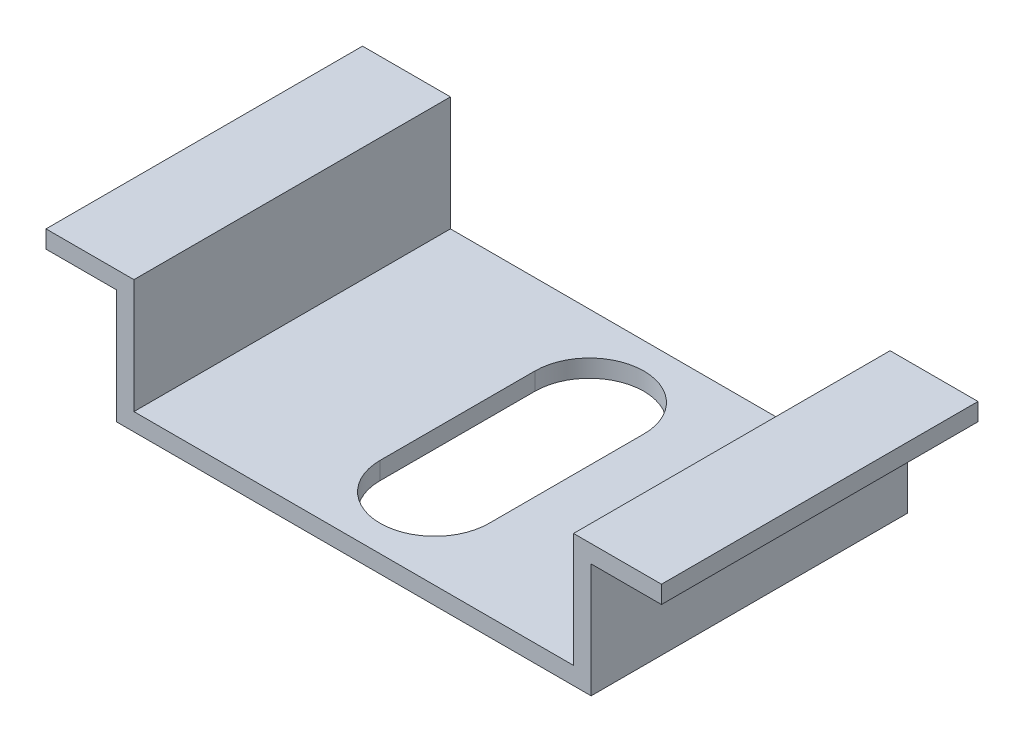
ISO-10303-21;
HEADER;
FILE_DESCRIPTION(('STEP AP214'),'2;1');
FILE_NAME('part.step','',(''),(''),'','','');
FILE_SCHEMA(('AUTOMOTIVE_DESIGN { 1 0 10303 214 1 1 1 1 }'));
ENDSEC;
DATA;
#1=APPLICATION_CONTEXT('core data for automotive mechanical design processes');
#2=APPLICATION_PROTOCOL_DEFINITION('international standard','automotive_design',2000,#1);
#3=PRODUCT_CONTEXT('',#1,'mechanical');
#4=PRODUCT('Part','Part','',(#3));
#5=PRODUCT_RELATED_PRODUCT_CATEGORY('part','',(#4));
#6=PRODUCT_DEFINITION_FORMATION('','',#4);
#7=PRODUCT_DEFINITION_CONTEXT('part definition',#1,'design');
#8=PRODUCT_DEFINITION('design','',#6,#7);
#9=PRODUCT_DEFINITION_SHAPE('','',#8);
#10=(LENGTH_UNIT() NAMED_UNIT(*) SI_UNIT(.MILLI.,.METRE.));
#11=(NAMED_UNIT(*) PLANE_ANGLE_UNIT() SI_UNIT($,.RADIAN.));
#12=(NAMED_UNIT(*) SI_UNIT($,.STERADIAN.) SOLID_ANGLE_UNIT());
#13=UNCERTAINTY_MEASURE_WITH_UNIT(LENGTH_MEASURE(1.E-05),#10,'distance_accuracy_value','');
#14=(GEOMETRIC_REPRESENTATION_CONTEXT(3) GLOBAL_UNCERTAINTY_ASSIGNED_CONTEXT((#13)) GLOBAL_UNIT_ASSIGNED_CONTEXT((#10,
#11,#12)) REPRESENTATION_CONTEXT('',''));
#15=CARTESIAN_POINT('',(0.,0.,0.));
#16=DIRECTION('',(0.,0.,1.));
#17=DIRECTION('',(1.,0.,0.));
#18=AXIS2_PLACEMENT_3D('',#15,#16,#17);
#19=CARTESIAN_POINT('',(0.,0.,0.));
#20=DIRECTION('',(0.,1.,0.));
#21=DIRECTION('',(0.,0.,1.));
#22=AXIS2_PLACEMENT_3D('',#19,#20,#21);
#23=PLANE('',#22);
#24=DIRECTION('',(0.,0.,1.));
#25=VECTOR('',#24,1.);
#26=CARTESIAN_POINT('',(-35.,0.,0.));
#27=LINE('',#26,#25);
#28=CARTESIAN_POINT('',(-35.,0.,15.));
#29=VERTEX_POINT('',#28);
#30=CARTESIAN_POINT('',(-35.,0.,32.9999999999999));
#31=VERTEX_POINT('',#30);
#32=EDGE_CURVE('E182',#29,#31,#27,.T.);
#33=ORIENTED_EDGE('',*,*,#32,.T.);
#34=DIRECTION('',(1.,0.,0.));
#35=VECTOR('',#34,1.);
#36=CARTESIAN_POINT('',(0.,0.,32.9999999999999));
#37=LINE('',#36,#35);
#38=CARTESIAN_POINT('',(-30.,0.,32.9999999999999));
#39=VERTEX_POINT('',#38);
#40=EDGE_CURVE('E198',#31,#39,#37,.T.);
#41=ORIENTED_EDGE('',*,*,#40,.T.);
#42=DIRECTION('',(0.,0.,-1.));
#43=VECTOR('',#42,1.);
#44=CARTESIAN_POINT('',(-30.,0.,175.));
#45=LINE('',#44,#43);
#46=CARTESIAN_POINT('',(-30.,0.,15.));
#47=VERTEX_POINT('',#46);
#48=EDGE_CURVE('E170',#39,#47,#45,.T.);
#49=ORIENTED_EDGE('',*,*,#48,.T.);
#50=DIRECTION('',(-1.,0.,0.));
#51=VECTOR('',#50,1.);
#52=CARTESIAN_POINT('',(0.,0.,15.));
#53=LINE('',#52,#51);
#54=EDGE_CURVE('E227',#47,#29,#53,.T.);
#55=ORIENTED_EDGE('',*,*,#54,.T.);
#56=EDGE_LOOP('',(#33,#41,#49,#55));
#57=FACE_BOUND('',#56,.T.);
#58=ADVANCED_FACE('F35',(#57),#23,.T.);
#59=CARTESIAN_POINT('',(0.,-7.5,175.));
#60=DIRECTION('',(1.,0.,0.));
#61=DIRECTION('',(0.,0.,-1.));
#62=AXIS2_PLACEMENT_3D('',#59,#60,#61);
#63=PLANE('',#62);
#64=DIRECTION('',(0.,0.,-1.));
#65=VECTOR('',#64,1.);
#66=CARTESIAN_POINT('',(0.,0.,175.));
#67=LINE('',#66,#65);
#68=CARTESIAN_POINT('',(0.,0.,32.9999999999999));
#69=VERTEX_POINT('',#68);
#70=CARTESIAN_POINT('',(0.,0.,15.));
#71=VERTEX_POINT('',#70);
#72=EDGE_CURVE('E152',#69,#71,#67,.T.);
#73=ORIENTED_EDGE('',*,*,#72,.F.);
#74=DIRECTION('',(0.,-1.,0.));
#75=VECTOR('',#74,1.);
#76=CARTESIAN_POINT('',(0.,-7.5,32.9999999999999));
#77=LINE('',#76,#75);
#78=CARTESIAN_POINT('',(0.,-1.,32.9999999999999));
#79=VERTEX_POINT('',#78);
#80=EDGE_CURVE('E147',#69,#79,#77,.T.);
#81=ORIENTED_EDGE('',*,*,#80,.T.);
#82=DIRECTION('',(0.,0.,-1.));
#83=VECTOR('',#82,1.);
#84=CARTESIAN_POINT('',(0.,-1.,175.));
#85=LINE('',#84,#83);
#86=CARTESIAN_POINT('',(0.,-1.,15.));
#87=VERTEX_POINT('',#86);
#88=EDGE_CURVE('E57',#79,#87,#85,.T.);
#89=ORIENTED_EDGE('',*,*,#88,.T.);
#90=DIRECTION('',(0.,1.,0.));
#91=VECTOR('',#90,1.);
#92=CARTESIAN_POINT('',(0.,-7.5,15.));
#93=LINE('',#92,#91);
#94=EDGE_CURVE('E193',#87,#71,#93,.T.);
#95=ORIENTED_EDGE('',*,*,#94,.T.);
#96=EDGE_LOOP('',(#73,#81,#89,#95));
#97=FACE_BOUND('',#96,.T.);
#98=ADVANCED_FACE('F37',(#97),#63,.T.);
#99=CARTESIAN_POINT('',(-35.,-7.5,0.));
#100=DIRECTION('',(-1.,0.,0.));
#101=DIRECTION('',(0.,0.,1.));
#102=AXIS2_PLACEMENT_3D('',#99,#100,#101);
#103=PLANE('',#102);
#104=DIRECTION('',(0.,0.,-1.));
#105=VECTOR('',#104,1.);
#106=CARTESIAN_POINT('',(-35.,-1.,175.));
#107=LINE('',#106,#105);
#108=CARTESIAN_POINT('',(-35.,-1.,32.9999999999999));
#109=VERTEX_POINT('',#108);
#110=CARTESIAN_POINT('',(-35.,-1.,15.));
#111=VERTEX_POINT('',#110);
#112=EDGE_CURVE('E162',#109,#111,#107,.T.);
#113=ORIENTED_EDGE('',*,*,#112,.F.);
#114=DIRECTION('',(0.,1.,0.));
#115=VECTOR('',#114,1.);
#116=CARTESIAN_POINT('',(-35.,-7.5,32.9999999999999));
#117=LINE('',#116,#115);
#118=EDGE_CURVE('E202',#109,#31,#117,.T.);
#119=ORIENTED_EDGE('',*,*,#118,.T.);
#120=ORIENTED_EDGE('',*,*,#32,.F.);
#121=DIRECTION('',(0.,-1.,0.));
#122=VECTOR('',#121,1.);
#123=CARTESIAN_POINT('',(-35.,-7.5,15.));
#124=LINE('',#123,#122);
#125=EDGE_CURVE('E224',#29,#111,#124,.T.);
#126=ORIENTED_EDGE('',*,*,#125,.T.);
#127=EDGE_LOOP('',(#113,#119,#120,#126));
#128=FACE_BOUND('',#127,.T.);
#129=ADVANCED_FACE('F298',(#128),#103,.T.);
#130=CARTESIAN_POINT('',(0.,-7.5,0.));
#131=DIRECTION('',(0.,1.,0.));
#132=DIRECTION('',(0.,0.,1.));
#133=AXIS2_PLACEMENT_3D('',#130,#131,#132);
#134=PLANE('',#133);
#135=DIRECTION('',(0.,0.,1.));
#136=VECTOR('',#135,1.);
#137=CARTESIAN_POINT('',(-20.6000000000001,-7.50000000000003,19.6));
#138=LINE('',#137,#136);
#139=CARTESIAN_POINT('',(-20.6000000000001,-7.50000000000003,19.6));
#140=VERTEX_POINT('',#139);
#141=CARTESIAN_POINT('',(-20.6000000000001,-7.50000000000003,28.4));
#142=VERTEX_POINT('',#141);
#143=EDGE_CURVE('E241',#140,#142,#138,.T.);
#144=ORIENTED_EDGE('',*,*,#143,.T.);
#145=CARTESIAN_POINT('',(-17.5000000000001,-7.50000000000003,28.4));
#146=DIRECTION('',(0.,1.,0.));
#147=DIRECTION('',(-1.,0.,0.));
#148=AXIS2_PLACEMENT_3D('',#145,#146,#147);
#149=CIRCLE('',#148,3.1);
#150=CARTESIAN_POINT('',(-14.4000000000001,-7.50000000000002,28.4));
#151=VERTEX_POINT('',#150);
#152=EDGE_CURVE('E231',#142,#151,#149,.T.);
#153=ORIENTED_EDGE('',*,*,#152,.T.);
#154=DIRECTION('',(0.,0.,-1.));
#155=VECTOR('',#154,1.);
#156=CARTESIAN_POINT('',(-14.4000000000001,-7.50000000000002,28.4));
#157=LINE('',#156,#155);
#158=CARTESIAN_POINT('',(-14.4000000000001,-7.5,19.6));
#159=VERTEX_POINT('',#158);
#160=EDGE_CURVE('E234',#151,#159,#157,.T.);
#161=ORIENTED_EDGE('',*,*,#160,.T.);
#162=CARTESIAN_POINT('',(-17.5000000000001,-7.50000000000003,19.6));
#163=DIRECTION('',(0.,1.,0.));
#164=DIRECTION('',(-1.,0.,0.));
#165=AXIS2_PLACEMENT_3D('',#162,#163,#164);
#166=CIRCLE('',#165,3.1);
#167=EDGE_CURVE('E238',#159,#140,#166,.T.);
#168=ORIENTED_EDGE('',*,*,#167,.T.);
#169=EDGE_LOOP('',(#144,#153,#161,#168));
#170=FACE_BOUND('',#169,.T.);
#171=DIRECTION('',(1.,0.,0.));
#172=VECTOR('',#171,1.);
#173=CARTESIAN_POINT('',(0.,-7.5,32.9999999999999));
#174=LINE('',#173,#172);
#175=CARTESIAN_POINT('',(-31.,-7.5,32.9999999999999));
#176=VERTEX_POINT('',#175);
#177=CARTESIAN_POINT('',(-4.,-7.5,32.9999999999999));
#178=VERTEX_POINT('',#177);
#179=EDGE_CURVE('E154',#176,#178,#174,.T.);
#180=ORIENTED_EDGE('',*,*,#179,.F.);
#181=DIRECTION('',(0.,0.,-1.));
#182=VECTOR('',#181,1.);
#183=CARTESIAN_POINT('',(-31.,-7.5,175.));
#184=LINE('',#183,#182);
#185=CARTESIAN_POINT('',(-31.,-7.5,15.));
#186=VERTEX_POINT('',#185);
#187=EDGE_CURVE('E168',#176,#186,#184,.T.);
#188=ORIENTED_EDGE('',*,*,#187,.T.);
#189=DIRECTION('',(-1.,0.,0.));
#190=VECTOR('',#189,1.);
#191=CARTESIAN_POINT('',(0.,-7.5,15.));
#192=LINE('',#191,#190);
#193=CARTESIAN_POINT('',(-4.,-7.5,15.));
#194=VERTEX_POINT('',#193);
#195=EDGE_CURVE('E197',#194,#186,#192,.T.);
#196=ORIENTED_EDGE('',*,*,#195,.F.);
#197=DIRECTION('',(0.,0.,-1.));
#198=VECTOR('',#197,1.);
#199=CARTESIAN_POINT('',(-4.,-7.5,175.));
#200=LINE('',#199,#198);
#201=EDGE_CURVE('E159',#178,#194,#200,.T.);
#202=ORIENTED_EDGE('',*,*,#201,.F.);
#203=EDGE_LOOP('',(#180,#188,#196,#202));
#204=FACE_BOUND('',#203,.T.);
#205=ADVANCED_FACE('F276',(#170,#204),#134,.F.);
#206=DIRECTION('',(0.,0.,-1.));
#207=VECTOR('',#206,1.);
#208=CARTESIAN_POINT('',(-5.,0.,175.));
#209=LINE('',#208,#207);
#210=CARTESIAN_POINT('',(-5.,0.,32.9999999999999));
#211=VERTEX_POINT('',#210);
#212=CARTESIAN_POINT('',(-5.,0.,15.));
#213=VERTEX_POINT('',#212);
#214=EDGE_CURVE('E178',#211,#213,#209,.T.);
#215=ORIENTED_EDGE('',*,*,#214,.F.);
#216=DIRECTION('',(1.,0.,0.));
#217=VECTOR('',#216,1.);
#218=CARTESIAN_POINT('',(0.,0.,32.9999999999999));
#219=LINE('',#218,#217);
#220=EDGE_CURVE('E310',#211,#69,#219,.T.);
#221=ORIENTED_EDGE('',*,*,#220,.T.);
#222=ORIENTED_EDGE('',*,*,#72,.T.);
#223=DIRECTION('',(-1.,0.,0.));
#224=VECTOR('',#223,1.);
#225=CARTESIAN_POINT('',(0.,0.,15.));
#226=LINE('',#225,#224);
#227=EDGE_CURVE('E210',#71,#213,#226,.T.);
#228=ORIENTED_EDGE('',*,*,#227,.T.);
#229=EDGE_LOOP('',(#215,#221,#222,#228));
#230=FACE_BOUND('',#229,.T.);
#231=ADVANCED_FACE('F293',(#230),#23,.T.);
#232=CARTESIAN_POINT('',(-30.,-6.50000000000002,175.));
#233=DIRECTION('',(-1.,0.,0.));
#234=DIRECTION('',(0.,0.,1.));
#235=AXIS2_PLACEMENT_3D('',#232,#233,#234);
#236=PLANE('',#235);
#237=DIRECTION('',(0.,1.,0.));
#238=VECTOR('',#237,1.);
#239=CARTESIAN_POINT('',(-30.,-6.50000000000002,32.9999999999999));
#240=LINE('',#239,#238);
#241=CARTESIAN_POINT('',(-30.,-6.50000000000002,32.9999999999999));
#242=VERTEX_POINT('',#241);
#243=EDGE_CURVE('E324',#242,#39,#240,.T.);
#244=ORIENTED_EDGE('',*,*,#243,.F.);
#245=DIRECTION('',(0.,0.,-1.));
#246=VECTOR('',#245,1.);
#247=CARTESIAN_POINT('',(-30.,-6.50000000000002,175.));
#248=LINE('',#247,#246);
#249=CARTESIAN_POINT('',(-30.,-6.50000000000002,15.));
#250=VERTEX_POINT('',#249);
#251=EDGE_CURVE('E174',#242,#250,#248,.T.);
#252=ORIENTED_EDGE('',*,*,#251,.T.);
#253=DIRECTION('',(0.,-1.,0.));
#254=VECTOR('',#253,1.);
#255=CARTESIAN_POINT('',(-30.,-6.50000000000002,15.));
#256=LINE('',#255,#254);
#257=EDGE_CURVE('E222',#47,#250,#256,.T.);
#258=ORIENTED_EDGE('',*,*,#257,.F.);
#259=ORIENTED_EDGE('',*,*,#48,.F.);
#260=EDGE_LOOP('',(#244,#252,#258,#259));
#261=FACE_BOUND('',#260,.T.);
#262=ADVANCED_FACE('F301',(#261),#236,.F.);
#263=CARTESIAN_POINT('',(-5.,-6.50000000000001,175.));
#264=DIRECTION('',(0.,-1.,0.));
#265=DIRECTION('',(1.,0.,0.));
#266=AXIS2_PLACEMENT_3D('',#263,#264,#265);
#267=PLANE('',#266);
#268=DIRECTION('',(0.,0.,-1.));
#269=VECTOR('',#268,1.);
#270=CARTESIAN_POINT('',(-14.4000000000001,-6.50000000000001,28.4));
#271=LINE('',#270,#269);
#272=CARTESIAN_POINT('',(-14.4000000000001,-6.50000000000001,28.4));
#273=VERTEX_POINT('',#272);
#274=CARTESIAN_POINT('',(-14.4000000000001,-6.50000000000001,19.6));
#275=VERTEX_POINT('',#274);
#276=EDGE_CURVE('E246',#273,#275,#271,.T.);
#277=ORIENTED_EDGE('',*,*,#276,.F.);
#278=CARTESIAN_POINT('',(-17.5000000000001,-6.50000000000001,28.4));
#279=DIRECTION('',(0.,1.,0.));
#280=DIRECTION('',(-1.,0.,0.));
#281=AXIS2_PLACEMENT_3D('',#278,#279,#280);
#282=CIRCLE('',#281,3.1);
#283=CARTESIAN_POINT('',(-20.6000000000001,-6.50000000000002,28.4));
#284=VERTEX_POINT('',#283);
#285=EDGE_CURVE('E230',#284,#273,#282,.T.);
#286=ORIENTED_EDGE('',*,*,#285,.F.);
#287=DIRECTION('',(0.,0.,1.));
#288=VECTOR('',#287,1.);
#289=CARTESIAN_POINT('',(-20.6000000000001,-6.50000000000002,19.6));
#290=LINE('',#289,#288);
#291=CARTESIAN_POINT('',(-20.6000000000001,-6.50000000000002,19.6));
#292=VERTEX_POINT('',#291);
#293=EDGE_CURVE('E235',#292,#284,#290,.T.);
#294=ORIENTED_EDGE('',*,*,#293,.F.);
#295=CARTESIAN_POINT('',(-17.5000000000001,-6.50000000000001,19.6));
#296=DIRECTION('',(0.,1.,0.));
#297=DIRECTION('',(-1.,0.,0.));
#298=AXIS2_PLACEMENT_3D('',#295,#296,#297);
#299=CIRCLE('',#298,3.1);
#300=EDGE_CURVE('E249',#275,#292,#299,.T.);
#301=ORIENTED_EDGE('',*,*,#300,.F.);
#302=EDGE_LOOP('',(#277,#286,#294,#301));
#303=FACE_BOUND('',#302,.T.);
#304=DIRECTION('',(-1.,0.,0.));
#305=VECTOR('',#304,1.);
#306=CARTESIAN_POINT('',(-5.,-6.50000000000001,32.9999999999999));
#307=LINE('',#306,#305);
#308=CARTESIAN_POINT('',(-5.,-6.50000000000001,32.9999999999999));
#309=VERTEX_POINT('',#308);
#310=EDGE_CURVE('E322',#309,#242,#307,.T.);
#311=ORIENTED_EDGE('',*,*,#310,.F.);
#312=DIRECTION('',(0.,0.,-1.));
#313=VECTOR('',#312,1.);
#314=CARTESIAN_POINT('',(-5.,-6.50000000000001,175.));
#315=LINE('',#314,#313);
#316=CARTESIAN_POINT('',(-5.,-6.50000000000001,15.));
#317=VERTEX_POINT('',#316);
#318=EDGE_CURVE('E176',#309,#317,#315,.T.);
#319=ORIENTED_EDGE('',*,*,#318,.T.);
#320=DIRECTION('',(1.,0.,0.));
#321=VECTOR('',#320,1.);
#322=CARTESIAN_POINT('',(-5.,-6.50000000000001,15.));
#323=LINE('',#322,#321);
#324=EDGE_CURVE('E219',#250,#317,#323,.T.);
#325=ORIENTED_EDGE('',*,*,#324,.F.);
#326=ORIENTED_EDGE('',*,*,#251,.F.);
#327=EDGE_LOOP('',(#311,#319,#325,#326));
#328=FACE_BOUND('',#327,.T.);
#329=ADVANCED_FACE('F269',(#303,#328),#267,.F.);
#330=CARTESIAN_POINT('',(-5.,0.,175.));
#331=DIRECTION('',(1.,0.,0.));
#332=DIRECTION('',(0.,0.,-1.));
#333=AXIS2_PLACEMENT_3D('',#330,#331,#332);
#334=PLANE('',#333);
#335=DIRECTION('',(0.,-1.,0.));
#336=VECTOR('',#335,1.);
#337=CARTESIAN_POINT('',(-5.,0.,32.9999999999999));
#338=LINE('',#337,#336);
#339=EDGE_CURVE('E316',#211,#309,#338,.T.);
#340=ORIENTED_EDGE('',*,*,#339,.F.);
#341=ORIENTED_EDGE('',*,*,#214,.T.);
#342=DIRECTION('',(0.,1.,0.));
#343=VECTOR('',#342,1.);
#344=CARTESIAN_POINT('',(-5.,0.,15.));
#345=LINE('',#344,#343);
#346=EDGE_CURVE('E216',#317,#213,#345,.T.);
#347=ORIENTED_EDGE('',*,*,#346,.F.);
#348=ORIENTED_EDGE('',*,*,#318,.F.);
#349=EDGE_LOOP('',(#340,#341,#347,#348));
#350=FACE_BOUND('',#349,.T.);
#351=ADVANCED_FACE('F314',(#350),#334,.F.);
#352=CARTESIAN_POINT('',(-31.,-1.,175.));
#353=DIRECTION('',(1.,0.,0.));
#354=DIRECTION('',(0.,0.,-1.));
#355=AXIS2_PLACEMENT_3D('',#352,#353,#354);
#356=PLANE('',#355);
#357=DIRECTION('',(0.,-1.,0.));
#358=VECTOR('',#357,1.);
#359=CARTESIAN_POINT('',(-31.,-1.,32.9999999999999));
#360=LINE('',#359,#358);
#361=CARTESIAN_POINT('',(-31.,-1.,32.9999999999999));
#362=VERTEX_POINT('',#361);
#363=EDGE_CURVE('E153',#362,#176,#360,.T.);
#364=ORIENTED_EDGE('',*,*,#363,.F.);
#365=DIRECTION('',(0.,0.,-1.));
#366=VECTOR('',#365,1.);
#367=CARTESIAN_POINT('',(-31.,-1.,175.));
#368=LINE('',#367,#366);
#369=CARTESIAN_POINT('',(-31.,-1.,15.));
#370=VERTEX_POINT('',#369);
#371=EDGE_CURVE('E171',#362,#370,#368,.T.);
#372=ORIENTED_EDGE('',*,*,#371,.T.);
#373=DIRECTION('',(0.,1.,0.));
#374=VECTOR('',#373,1.);
#375=CARTESIAN_POINT('',(-31.,-1.,15.));
#376=LINE('',#375,#374);
#377=EDGE_CURVE('E207',#186,#370,#376,.T.);
#378=ORIENTED_EDGE('',*,*,#377,.F.);
#379=ORIENTED_EDGE('',*,*,#187,.F.);
#380=EDGE_LOOP('',(#364,#372,#378,#379));
#381=FACE_BOUND('',#380,.T.);
#382=ADVANCED_FACE('F349',(#381),#356,.F.);
#383=CARTESIAN_POINT('',(-35.,-1.,175.));
#384=DIRECTION('',(0.,1.,0.));
#385=DIRECTION('',(0.,0.,1.));
#386=AXIS2_PLACEMENT_3D('',#383,#384,#385);
#387=PLANE('',#386);
#388=DIRECTION('',(1.,0.,0.));
#389=VECTOR('',#388,1.);
#390=CARTESIAN_POINT('',(-35.,-1.,32.9999999999999));
#391=LINE('',#390,#389);
#392=EDGE_CURVE('E327',#109,#362,#391,.T.);
#393=ORIENTED_EDGE('',*,*,#392,.F.);
#394=ORIENTED_EDGE('',*,*,#112,.T.);
#395=DIRECTION('',(-1.,0.,0.));
#396=VECTOR('',#395,1.);
#397=CARTESIAN_POINT('',(-35.,-1.,15.));
#398=LINE('',#397,#396);
#399=EDGE_CURVE('E213',#370,#111,#398,.T.);
#400=ORIENTED_EDGE('',*,*,#399,.F.);
#401=ORIENTED_EDGE('',*,*,#371,.F.);
#402=EDGE_LOOP('',(#393,#394,#400,#401));
#403=FACE_BOUND('',#402,.T.);
#404=ADVANCED_FACE('F340',(#403),#387,.F.);
#405=CARTESIAN_POINT('',(-4.,-7.5,175.));
#406=DIRECTION('',(-1.,0.,0.));
#407=DIRECTION('',(0.,-1.,0.));
#408=AXIS2_PLACEMENT_3D('',#405,#406,#407);
#409=PLANE('',#408);
#410=DIRECTION('',(0.,1.,0.));
#411=VECTOR('',#410,1.);
#412=CARTESIAN_POINT('',(-4.,-7.5,32.9999999999999));
#413=LINE('',#412,#411);
#414=CARTESIAN_POINT('',(-4.,-1.,32.9999999999999));
#415=VERTEX_POINT('',#414);
#416=EDGE_CURVE('E49',#178,#415,#413,.T.);
#417=ORIENTED_EDGE('',*,*,#416,.F.);
#418=ORIENTED_EDGE('',*,*,#201,.T.);
#419=DIRECTION('',(0.,-1.,0.));
#420=VECTOR('',#419,1.);
#421=CARTESIAN_POINT('',(-4.,-7.5,15.));
#422=LINE('',#421,#420);
#423=CARTESIAN_POINT('',(-4.,-1.,15.));
#424=VERTEX_POINT('',#423);
#425=EDGE_CURVE('E190',#424,#194,#422,.T.);
#426=ORIENTED_EDGE('',*,*,#425,.F.);
#427=DIRECTION('',(0.,0.,-1.));
#428=VECTOR('',#427,1.);
#429=CARTESIAN_POINT('',(-4.,-1.,175.));
#430=LINE('',#429,#428);
#431=EDGE_CURVE('E160',#415,#424,#430,.T.);
#432=ORIENTED_EDGE('',*,*,#431,.F.);
#433=EDGE_LOOP('',(#417,#418,#426,#432));
#434=FACE_BOUND('',#433,.T.);
#435=ADVANCED_FACE('F195',(#434),#409,.F.);
#436=CARTESIAN_POINT('',(-4.,-1.,175.));
#437=DIRECTION('',(0.,1.,0.));
#438=DIRECTION('',(0.,0.,1.));
#439=AXIS2_PLACEMENT_3D('',#436,#437,#438);
#440=PLANE('',#439);
#441=DIRECTION('',(1.,0.,0.));
#442=VECTOR('',#441,1.);
#443=CARTESIAN_POINT('',(-4.,-1.,32.9999999999999));
#444=LINE('',#443,#442);
#445=EDGE_CURVE('E11',#415,#79,#444,.T.);
#446=ORIENTED_EDGE('',*,*,#445,.F.);
#447=ORIENTED_EDGE('',*,*,#431,.T.);
#448=DIRECTION('',(-1.,0.,0.));
#449=VECTOR('',#448,1.);
#450=CARTESIAN_POINT('',(-4.,-1.,15.));
#451=LINE('',#450,#449);
#452=EDGE_CURVE('E43',#87,#424,#451,.T.);
#453=ORIENTED_EDGE('',*,*,#452,.F.);
#454=ORIENTED_EDGE('',*,*,#88,.F.);
#455=EDGE_LOOP('',(#446,#447,#453,#454));
#456=FACE_BOUND('',#455,.T.);
#457=ADVANCED_FACE('F157',(#456),#440,.F.);
#458=CARTESIAN_POINT('',(-17.5000000000001,-7.50000000000003,28.4));
#459=DIRECTION('',(0.,1.,0.));
#460=DIRECTION('',(-1.,0.,0.));
#461=AXIS2_PLACEMENT_3D('',#458,#459,#460);
#462=CYLINDRICAL_SURFACE('',#461,3.1);
#463=ORIENTED_EDGE('',*,*,#285,.T.);
#464=DIRECTION('',(0.,1.,0.));
#465=VECTOR('',#464,1.);
#466=CARTESIAN_POINT('',(-14.4000000000001,-7.50000000000002,28.4));
#467=LINE('',#466,#465);
#468=EDGE_CURVE('E244',#151,#273,#467,.T.);
#469=ORIENTED_EDGE('',*,*,#468,.F.);
#470=ORIENTED_EDGE('',*,*,#152,.F.);
#471=DIRECTION('',(0.,1.,0.));
#472=VECTOR('',#471,1.);
#473=CARTESIAN_POINT('',(-20.6000000000001,-7.50000000000003,28.4));
#474=LINE('',#473,#472);
#475=EDGE_CURVE('E164',#142,#284,#474,.T.);
#476=ORIENTED_EDGE('',*,*,#475,.T.);
#477=EDGE_LOOP('',(#463,#469,#470,#476));
#478=FACE_BOUND('',#477,.T.);
#479=ADVANCED_FACE('F278',(#478),#462,.F.);
#480=CARTESIAN_POINT('',(-20.6000000000001,-7.50000000000003,19.6));
#481=DIRECTION('',(-1.,0.,0.));
#482=DIRECTION('',(0.,0.,1.));
#483=AXIS2_PLACEMENT_3D('',#480,#481,#482);
#484=PLANE('',#483);
#485=ORIENTED_EDGE('',*,*,#293,.T.);
#486=ORIENTED_EDGE('',*,*,#475,.F.);
#487=ORIENTED_EDGE('',*,*,#143,.F.);
#488=DIRECTION('',(0.,1.,0.));
#489=VECTOR('',#488,1.);
#490=CARTESIAN_POINT('',(-20.6000000000001,-7.50000000000003,19.6));
#491=LINE('',#490,#489);
#492=EDGE_CURVE('E255',#140,#292,#491,.T.);
#493=ORIENTED_EDGE('',*,*,#492,.T.);
#494=EDGE_LOOP('',(#485,#486,#487,#493));
#495=FACE_BOUND('',#494,.T.);
#496=ADVANCED_FACE('F280',(#495),#484,.F.);
#497=CARTESIAN_POINT('',(-17.5000000000001,-7.50000000000003,19.6));
#498=DIRECTION('',(0.,1.,0.));
#499=DIRECTION('',(-1.,0.,0.));
#500=AXIS2_PLACEMENT_3D('',#497,#498,#499);
#501=CYLINDRICAL_SURFACE('',#500,3.1);
#502=ORIENTED_EDGE('',*,*,#300,.T.);
#503=ORIENTED_EDGE('',*,*,#492,.F.);
#504=ORIENTED_EDGE('',*,*,#167,.F.);
#505=DIRECTION('',(0.,1.,0.));
#506=VECTOR('',#505,1.);
#507=CARTESIAN_POINT('',(-14.4000000000001,-7.50000000000002,19.6));
#508=LINE('',#507,#506);
#509=EDGE_CURVE('E257',#159,#275,#508,.T.);
#510=ORIENTED_EDGE('',*,*,#509,.T.);
#511=EDGE_LOOP('',(#502,#503,#504,#510));
#512=FACE_BOUND('',#511,.T.);
#513=ADVANCED_FACE('F273',(#512),#501,.F.);
#514=CARTESIAN_POINT('',(-14.4000000000001,-7.50000000000002,28.4));
#515=DIRECTION('',(1.,0.,0.));
#516=DIRECTION('',(0.,1.,0.));
#517=AXIS2_PLACEMENT_3D('',#514,#515,#516);
#518=PLANE('',#517);
#519=ORIENTED_EDGE('',*,*,#276,.T.);
#520=ORIENTED_EDGE('',*,*,#509,.F.);
#521=ORIENTED_EDGE('',*,*,#160,.F.);
#522=ORIENTED_EDGE('',*,*,#468,.T.);
#523=EDGE_LOOP('',(#519,#520,#521,#522));
#524=FACE_BOUND('',#523,.T.);
#525=ADVANCED_FACE('F262',(#524),#518,.F.);
#526=CARTESIAN_POINT('',(0.,0.,15.));
#527=DIRECTION('',(0.,0.,-1.));
#528=DIRECTION('',(-1.,0.,0.));
#529=AXIS2_PLACEMENT_3D('',#526,#527,#528);
#530=PLANE('',#529);
#531=ORIENTED_EDGE('',*,*,#257,.T.);
#532=ORIENTED_EDGE('',*,*,#324,.T.);
#533=ORIENTED_EDGE('',*,*,#346,.T.);
#534=ORIENTED_EDGE('',*,*,#227,.F.);
#535=ORIENTED_EDGE('',*,*,#94,.F.);
#536=ORIENTED_EDGE('',*,*,#452,.T.);
#537=ORIENTED_EDGE('',*,*,#425,.T.);
#538=ORIENTED_EDGE('',*,*,#195,.T.);
#539=ORIENTED_EDGE('',*,*,#377,.T.);
#540=ORIENTED_EDGE('',*,*,#399,.T.);
#541=ORIENTED_EDGE('',*,*,#125,.F.);
#542=ORIENTED_EDGE('',*,*,#54,.F.);
#543=EDGE_LOOP('',(#531,#532,#533,#534,#535,#536,#537,#538,#539,#540,#541,#542));
#544=FACE_BOUND('',#543,.T.);
#545=ADVANCED_FACE('F188',(#544),#530,.T.);
#546=CARTESIAN_POINT('',(0.,0.,32.9999999999999));
#547=DIRECTION('',(0.,0.,1.));
#548=DIRECTION('',(1.,0.,0.));
#549=AXIS2_PLACEMENT_3D('',#546,#547,#548);
#550=PLANE('',#549);
#551=ORIENTED_EDGE('',*,*,#118,.F.);
#552=ORIENTED_EDGE('',*,*,#392,.T.);
#553=ORIENTED_EDGE('',*,*,#363,.T.);
#554=ORIENTED_EDGE('',*,*,#179,.T.);
#555=ORIENTED_EDGE('',*,*,#416,.T.);
#556=ORIENTED_EDGE('',*,*,#445,.T.);
#557=ORIENTED_EDGE('',*,*,#80,.F.);
#558=ORIENTED_EDGE('',*,*,#220,.F.);
#559=ORIENTED_EDGE('',*,*,#339,.T.);
#560=ORIENTED_EDGE('',*,*,#310,.T.);
#561=ORIENTED_EDGE('',*,*,#243,.T.);
#562=ORIENTED_EDGE('',*,*,#40,.F.);
#563=EDGE_LOOP('',(#551,#552,#553,#554,#555,#556,#557,#558,#559,#560,#561,#562));
#564=FACE_BOUND('',#563,.T.);
#565=ADVANCED_FACE('F146',(#564),#550,.T.);
#566=CLOSED_SHELL('',(#58,#98,#129,#205,#231,#262,#329,#351,#382,#404,#435,#457,#479,#496,#513,
#525,#545,#565));
#567=MANIFOLD_SOLID_BREP('B2',#566);
#568=ADVANCED_BREP_SHAPE_REPRESENTATION('',(#18,#567),#14);
#569=SHAPE_DEFINITION_REPRESENTATION(#9,#568);
ENDSEC;
END-ISO-10303-21;
